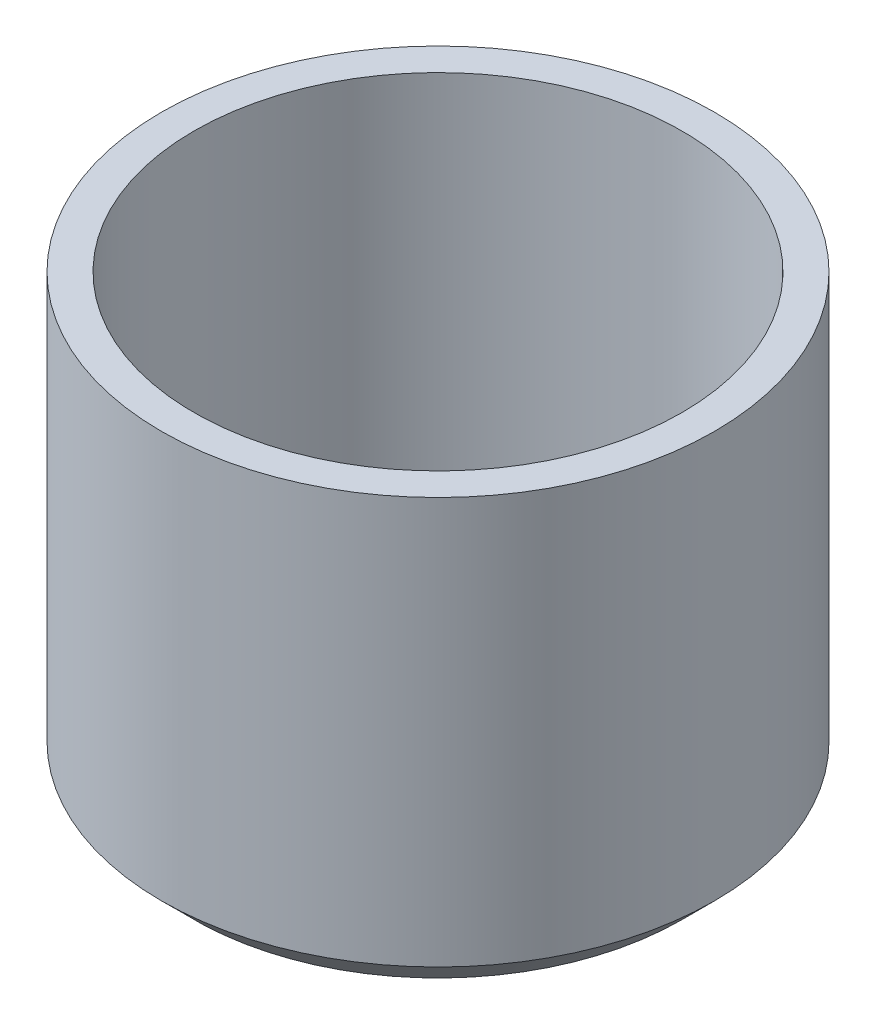
ISO-10303-21;
HEADER;
FILE_DESCRIPTION(('STEP AP214'),'2;1');
FILE_NAME('part.step','',(''),(''),'','','');
FILE_SCHEMA(('AUTOMOTIVE_DESIGN { 1 0 10303 214 1 1 1 1 }'));
ENDSEC;
DATA;
#1=APPLICATION_CONTEXT('core data for automotive mechanical design processes');
#2=APPLICATION_PROTOCOL_DEFINITION('international standard','automotive_design',2000,#1);
#3=PRODUCT_CONTEXT('',#1,'mechanical');
#4=PRODUCT('Part','Part','',(#3));
#5=PRODUCT_RELATED_PRODUCT_CATEGORY('part','',(#4));
#6=PRODUCT_DEFINITION_FORMATION('','',#4);
#7=PRODUCT_DEFINITION_CONTEXT('part definition',#1,'design');
#8=PRODUCT_DEFINITION('design','',#6,#7);
#9=PRODUCT_DEFINITION_SHAPE('','',#8);
#10=(LENGTH_UNIT() NAMED_UNIT(*) SI_UNIT(.MILLI.,.METRE.));
#11=(NAMED_UNIT(*) PLANE_ANGLE_UNIT() SI_UNIT($,.RADIAN.));
#12=(NAMED_UNIT(*) SI_UNIT($,.STERADIAN.) SOLID_ANGLE_UNIT());
#13=UNCERTAINTY_MEASURE_WITH_UNIT(LENGTH_MEASURE(1.E-05),#10,'distance_accuracy_value','');
#14=(GEOMETRIC_REPRESENTATION_CONTEXT(3) GLOBAL_UNCERTAINTY_ASSIGNED_CONTEXT((#13)) GLOBAL_UNIT_ASSIGNED_CONTEXT((#10,
#11,#12)) REPRESENTATION_CONTEXT('',''));
#15=CARTESIAN_POINT('',(0.,0.,0.));
#16=DIRECTION('',(0.,0.,1.));
#17=DIRECTION('',(1.,0.,0.));
#18=AXIS2_PLACEMENT_3D('',#15,#16,#17);
#19=CARTESIAN_POINT('',(0.,0.,0.));
#20=DIRECTION('',(0.,1.,0.));
#21=DIRECTION('',(-1.,0.,0.));
#22=AXIS2_PLACEMENT_3D('',#19,#20,#21);
#23=PLANE('',#22);
#24=CARTESIAN_POINT('',(0.,0.,0.));
#25=DIRECTION('',(0.,-1.,0.));
#26=DIRECTION('',(1.,0.,0.));
#27=AXIS2_PLACEMENT_3D('',#24,#25,#26);
#28=CIRCLE('',#27,9.);
#29=CARTESIAN_POINT('',(9.,0.,0.));
#30=VERTEX_POINT('',#29);
#31=EDGE_CURVE('E10',#30,#30,#28,.T.);
#32=ORIENTED_EDGE('',*,*,#31,.T.);
#33=EDGE_LOOP('',(#32));
#34=FACE_BOUND('',#33,.T.);
#35=ADVANCED_FACE('F41',(#34),#23,.F.);
#36=CARTESIAN_POINT('',(0.,1.20000000000003,0.));
#37=DIRECTION('',(0.,1.,0.));
#38=DIRECTION('',(-1.,0.,0.));
#39=AXIS2_PLACEMENT_3D('',#36,#37,#38);
#40=CONICAL_SURFACE('',#39,10.2,0.785398163397455);
#41=ORIENTED_EDGE('',*,*,#31,.F.);
#42=EDGE_LOOP('',(#41));
#43=FACE_BOUND('',#42,.T.);
#44=CARTESIAN_POINT('',(0.,1.20000000000003,0.));
#45=DIRECTION('',(0.,-1.,0.));
#46=DIRECTION('',(1.,0.,0.));
#47=AXIS2_PLACEMENT_3D('',#44,#45,#46);
#48=CIRCLE('',#47,10.2);
#49=CARTESIAN_POINT('',(10.2,1.20000000000007,0.));
#50=VERTEX_POINT('',#49);
#51=EDGE_CURVE('E48',#50,#50,#48,.T.);
#52=ORIENTED_EDGE('',*,*,#51,.T.);
#53=EDGE_LOOP('',(#52));
#54=FACE_BOUND('',#53,.T.);
#55=ADVANCED_FACE('F85',(#43,#54),#40,.T.);
#56=CARTESIAN_POINT('',(1.26246937281076E-12,-368.0401548753,0.));
#57=DIRECTION('',(0.,-1.,0.));
#58=DIRECTION('',(1.,0.,0.));
#59=AXIS2_PLACEMENT_3D('',#56,#57,#58);
#60=CYLINDRICAL_SURFACE('',#59,10.2);
#61=ORIENTED_EDGE('',*,*,#51,.F.);
#62=EDGE_LOOP('',(#61));
#63=FACE_BOUND('',#62,.T.);
#64=CARTESIAN_POINT('',(0.,16.2,0.));
#65=DIRECTION('',(0.,-1.,0.));
#66=DIRECTION('',(1.,0.,0.));
#67=AXIS2_PLACEMENT_3D('',#64,#65,#66);
#68=CIRCLE('',#67,10.1999999999999);
#69=CARTESIAN_POINT('',(10.1999999999999,16.2000000000001,0.));
#70=VERTEX_POINT('',#69);
#71=EDGE_CURVE('E53',#70,#70,#68,.T.);
#72=ORIENTED_EDGE('',*,*,#71,.T.);
#73=EDGE_LOOP('',(#72));
#74=FACE_BOUND('',#73,.T.);
#75=ADVANCED_FACE('F89',(#63,#74),#60,.T.);
#76=CARTESIAN_POINT('',(-10.2,16.2,0.));
#77=DIRECTION('',(0.,-1.,0.));
#78=DIRECTION('',(1.,0.,0.));
#79=AXIS2_PLACEMENT_3D('',#76,#77,#78);
#80=PLANE('',#79);
#81=ORIENTED_EDGE('',*,*,#71,.F.);
#82=EDGE_LOOP('',(#81));
#83=FACE_BOUND('',#82,.T.);
#84=CARTESIAN_POINT('',(0.,16.2,0.));
#85=DIRECTION('',(0.,-1.,0.));
#86=DIRECTION('',(1.,0.,0.));
#87=AXIS2_PLACEMENT_3D('',#84,#85,#86);
#88=CIRCLE('',#87,8.99999999999994);
#89=CARTESIAN_POINT('',(8.99999999999989,16.2000000000001,0.));
#90=VERTEX_POINT('',#89);
#91=EDGE_CURVE('E58',#90,#90,#88,.T.);
#92=ORIENTED_EDGE('',*,*,#91,.T.);
#93=EDGE_LOOP('',(#92));
#94=FACE_BOUND('',#93,.T.);
#95=ADVANCED_FACE('F94',(#83,#94),#80,.F.);
#96=CARTESIAN_POINT('',(1.26246937281076E-12,-368.0401548753,0.));
#97=DIRECTION('',(0.,-1.,0.));
#98=DIRECTION('',(1.,0.,0.));
#99=AXIS2_PLACEMENT_3D('',#96,#97,#98);
#100=CYLINDRICAL_SURFACE('',#99,8.99999999999997);
#101=ORIENTED_EDGE('',*,*,#91,.F.);
#102=EDGE_LOOP('',(#101));
#103=FACE_BOUND('',#102,.T.);
#104=CARTESIAN_POINT('',(0.,1.69705627484779,0.));
#105=DIRECTION('',(0.,-1.,0.));
#106=DIRECTION('',(1.,0.,0.));
#107=AXIS2_PLACEMENT_3D('',#104,#105,#106);
#108=CIRCLE('',#107,8.99999999999999);
#109=CARTESIAN_POINT('',(8.99999999999999,1.69705627484782,0.));
#110=VERTEX_POINT('',#109);
#111=EDGE_CURVE('E64',#110,#110,#108,.T.);
#112=ORIENTED_EDGE('',*,*,#111,.T.);
#113=EDGE_LOOP('',(#112));
#114=FACE_BOUND('',#113,.T.);
#115=ADVANCED_FACE('F81',(#103,#114),#100,.F.);
#116=CARTESIAN_POINT('',(0.,1.20000000000003,0.));
#117=DIRECTION('',(0.,1.,0.));
#118=DIRECTION('',(-1.,0.,0.));
#119=AXIS2_PLACEMENT_3D('',#116,#117,#118);
#120=CONICAL_SURFACE('',#119,8.50294372515228,0.785398163397408);
#121=ORIENTED_EDGE('',*,*,#111,.F.);
#122=EDGE_LOOP('',(#121));
#123=FACE_BOUND('',#122,.T.);
#124=CARTESIAN_POINT('',(0.,1.20000000000003,0.));
#125=DIRECTION('',(0.,-1.,0.));
#126=DIRECTION('',(1.,0.,0.));
#127=AXIS2_PLACEMENT_3D('',#124,#125,#126);
#128=CIRCLE('',#127,8.50294372515228);
#129=CARTESIAN_POINT('',(8.50294372515228,1.20000000000006,0.));
#130=VERTEX_POINT('',#129);
#131=EDGE_CURVE('E68',#130,#130,#128,.T.);
#132=ORIENTED_EDGE('',*,*,#131,.T.);
#133=EDGE_LOOP('',(#132));
#134=FACE_BOUND('',#133,.T.);
#135=ADVANCED_FACE('F73',(#123,#134),#120,.F.);
#136=CARTESIAN_POINT('',(-8.50294372515229,1.19999999999998,0.));
#137=DIRECTION('',(0.,-1.,0.));
#138=DIRECTION('',(1.,0.,0.));
#139=AXIS2_PLACEMENT_3D('',#136,#137,#138);
#140=PLANE('',#139);
#141=ORIENTED_EDGE('',*,*,#131,.F.);
#142=EDGE_LOOP('',(#141));
#143=FACE_BOUND('',#142,.T.);
#144=ADVANCED_FACE('F75',(#143),#140,.F.);
#145=CLOSED_SHELL('',(#35,#55,#75,#95,#115,#135,#144));
#146=MANIFOLD_SOLID_BREP('B2',#145);
#147=ADVANCED_BREP_SHAPE_REPRESENTATION('',(#18,#146),#14);
#148=SHAPE_DEFINITION_REPRESENTATION(#9,#147);
ENDSEC;
END-ISO-10303-21;
